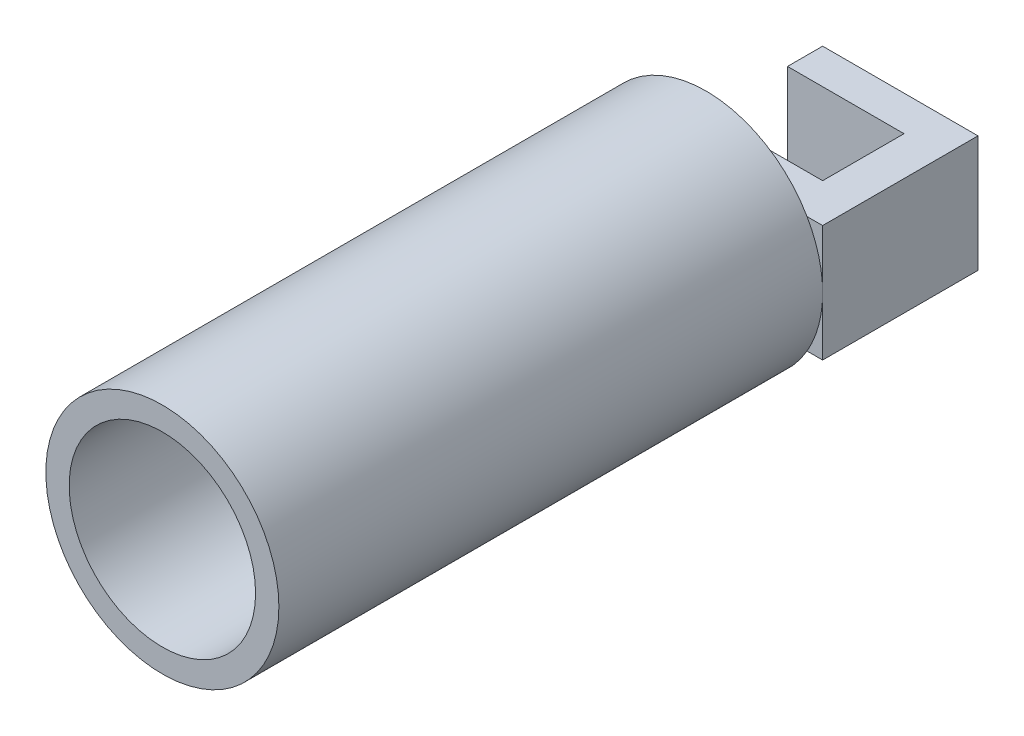
ISO-10303-21;
HEADER;
FILE_DESCRIPTION(('STEP AP214'),'2;1');
FILE_NAME('part.step','',(''),(''),'','','');
FILE_SCHEMA(('AUTOMOTIVE_DESIGN { 1 0 10303 214 1 1 1 1 }'));
ENDSEC;
DATA;
#1=APPLICATION_CONTEXT('core data for automotive mechanical design processes');
#2=APPLICATION_PROTOCOL_DEFINITION('international standard','automotive_design',2000,#1);
#3=PRODUCT_CONTEXT('',#1,'mechanical');
#4=PRODUCT('Part','Part','',(#3));
#5=PRODUCT_RELATED_PRODUCT_CATEGORY('part','',(#4));
#6=PRODUCT_DEFINITION_FORMATION('','',#4);
#7=PRODUCT_DEFINITION_CONTEXT('part definition',#1,'design');
#8=PRODUCT_DEFINITION('design','',#6,#7);
#9=PRODUCT_DEFINITION_SHAPE('','',#8);
#10=(LENGTH_UNIT() NAMED_UNIT(*) SI_UNIT(.MILLI.,.METRE.));
#11=(NAMED_UNIT(*) PLANE_ANGLE_UNIT() SI_UNIT($,.RADIAN.));
#12=(NAMED_UNIT(*) SI_UNIT($,.STERADIAN.) SOLID_ANGLE_UNIT());
#13=UNCERTAINTY_MEASURE_WITH_UNIT(LENGTH_MEASURE(1.E-05),#10,'distance_accuracy_value','');
#14=(GEOMETRIC_REPRESENTATION_CONTEXT(3) GLOBAL_UNCERTAINTY_ASSIGNED_CONTEXT((#13)) GLOBAL_UNIT_ASSIGNED_CONTEXT((#10,
#11,#12)) REPRESENTATION_CONTEXT('',''));
#15=CARTESIAN_POINT('',(0.,0.,0.));
#16=DIRECTION('',(0.,0.,1.));
#17=DIRECTION('',(1.,0.,0.));
#18=AXIS2_PLACEMENT_3D('',#15,#16,#17);
#19=CARTESIAN_POINT('',(10.,7.5,-20.));
#20=DIRECTION('',(1.,0.,0.));
#21=DIRECTION('',(0.,1.,0.));
#22=AXIS2_PLACEMENT_3D('',#19,#20,#21);
#23=PLANE('',#22);
#24=DIRECTION('',(0.,1.,0.));
#25=VECTOR('',#24,1.);
#26=CARTESIAN_POINT('',(10.,7.5,-15.4791523699152));
#27=LINE('',#26,#25);
#28=CARTESIAN_POINT('',(10.,-7.5,-15.4791523699152));
#29=VERTEX_POINT('',#28);
#30=CARTESIAN_POINT('',(10.,7.5,-15.4791523699152));
#31=VERTEX_POINT('',#30);
#32=EDGE_CURVE('E134',#29,#31,#27,.T.);
#33=ORIENTED_EDGE('',*,*,#32,.F.);
#34=DIRECTION('',(0.,0.,1.));
#35=VECTOR('',#34,1.);
#36=CARTESIAN_POINT('',(10.,-7.5,-20.));
#37=LINE('',#36,#35);
#38=CARTESIAN_POINT('',(10.,-7.5,-5.));
#39=VERTEX_POINT('',#38);
#40=EDGE_CURVE('E48',#29,#39,#37,.T.);
#41=ORIENTED_EDGE('',*,*,#40,.T.);
#42=DIRECTION('',(0.,1.,0.));
#43=VECTOR('',#42,1.);
#44=CARTESIAN_POINT('',(10.,7.5,-5.));
#45=LINE('',#44,#43);
#46=CARTESIAN_POINT('',(10.,7.5,-5.));
#47=VERTEX_POINT('',#46);
#48=EDGE_CURVE('E144',#39,#47,#45,.T.);
#49=ORIENTED_EDGE('',*,*,#48,.T.);
#50=DIRECTION('',(0.,0.,1.));
#51=VECTOR('',#50,1.);
#52=CARTESIAN_POINT('',(10.,7.5,-20.));
#53=LINE('',#52,#51);
#54=EDGE_CURVE('E147',#31,#47,#53,.T.);
#55=ORIENTED_EDGE('',*,*,#54,.F.);
#56=EDGE_LOOP('',(#33,#41,#49,#55));
#57=FACE_BOUND('',#56,.T.);
#58=ADVANCED_FACE('F33',(#57),#23,.F.);
#59=CARTESIAN_POINT('',(0.,0.,0.));
#60=DIRECTION('',(0.,0.,1.));
#61=DIRECTION('',(1.,0.,0.));
#62=AXIS2_PLACEMENT_3D('',#59,#60,#61);
#63=PLANE('',#62);
#64=DIRECTION('',(-1.,0.,0.));
#65=VECTOR('',#64,1.);
#66=CARTESIAN_POINT('',(5.,-7.5,0.));
#67=LINE('',#66,#65);
#68=CARTESIAN_POINT('',(12.9903810567666,-7.5,0.));
#69=VERTEX_POINT('',#68);
#70=CARTESIAN_POINT('',(0.,-7.5,0.));
#71=VERTEX_POINT('',#70);
#72=EDGE_CURVE('E168',#69,#71,#67,.T.);
#73=ORIENTED_EDGE('',*,*,#72,.F.);
#74=CARTESIAN_POINT('',(0.,0.,0.));
#75=DIRECTION('',(0.,0.,1.));
#76=DIRECTION('',(1.,0.,0.));
#77=AXIS2_PLACEMENT_3D('',#74,#75,#76);
#78=CIRCLE('',#77,15.);
#79=CARTESIAN_POINT('',(12.9903810567666,7.5,0.));
#80=VERTEX_POINT('',#79);
#81=EDGE_CURVE('E190',#80,#69,#78,.T.);
#82=ORIENTED_EDGE('',*,*,#81,.F.);
#83=DIRECTION('',(1.,0.,0.));
#84=VECTOR('',#83,1.);
#85=CARTESIAN_POINT('',(5.,7.5,0.));
#86=LINE('',#85,#84);
#87=CARTESIAN_POINT('',(0.,7.5,0.));
#88=VERTEX_POINT('',#87);
#89=EDGE_CURVE('E172',#88,#80,#86,.T.);
#90=ORIENTED_EDGE('',*,*,#89,.F.);
#91=DIRECTION('',(0.,1.,0.));
#92=VECTOR('',#91,1.);
#93=CARTESIAN_POINT('',(0.,7.5,0.));
#94=LINE('',#93,#92);
#95=EDGE_CURVE('E56',#71,#88,#94,.T.);
#96=ORIENTED_EDGE('',*,*,#95,.F.);
#97=EDGE_LOOP('',(#73,#82,#90,#96));
#98=FACE_BOUND('',#97,.T.);
#99=ADVANCED_FACE('F204',(#98),#63,.F.);
#100=CARTESIAN_POINT('',(0.,0.,70.));
#101=DIRECTION('',(0.,0.,-1.));
#102=DIRECTION('',(-1.,0.,0.));
#103=AXIS2_PLACEMENT_3D('',#100,#101,#102);
#104=CYLINDRICAL_SURFACE('',#103,15.);
#105=CARTESIAN_POINT('',(0.,0.,70.));
#106=DIRECTION('',(0.,0.,1.));
#107=DIRECTION('',(1.,0.,0.));
#108=AXIS2_PLACEMENT_3D('',#105,#106,#107);
#109=CIRCLE('',#108,15.);
#110=CARTESIAN_POINT('',(15.,0.,70.));
#111=VERTEX_POINT('',#110);
#112=EDGE_CURVE('E11',#111,#111,#109,.T.);
#113=ORIENTED_EDGE('',*,*,#112,.F.);
#114=EDGE_LOOP('',(#113));
#115=FACE_BOUND('',#114,.T.);
#116=CARTESIAN_POINT('',(15.,0.,0.));
#117=VERTEX_POINT('',#116);
#118=EDGE_CURVE('E37',#117,#80,#78,.T.);
#119=ORIENTED_EDGE('',*,*,#118,.T.);
#120=ORIENTED_EDGE('',*,*,#81,.T.);
#121=CARTESIAN_POINT('',(0.,0.,0.));
#122=DIRECTION('',(0.,0.,-1.));
#123=DIRECTION('',(-1.,0.,0.));
#124=AXIS2_PLACEMENT_3D('',#121,#122,#123);
#125=CIRCLE('',#124,15.);
#126=EDGE_CURVE('E165',#117,#69,#125,.T.);
#127=ORIENTED_EDGE('',*,*,#126,.F.);
#128=EDGE_LOOP('',(#119,#120,#127));
#129=FACE_BOUND('',#128,.T.);
#130=ADVANCED_FACE('F35',(#115,#129),#104,.T.);
#131=CARTESIAN_POINT('',(0.,0.,70.));
#132=DIRECTION('',(0.,0.,1.));
#133=DIRECTION('',(1.,0.,0.));
#134=AXIS2_PLACEMENT_3D('',#131,#132,#133);
#135=PLANE('',#134);
#136=CARTESIAN_POINT('',(0.,0.,70.));
#137=DIRECTION('',(0.,0.,1.));
#138=DIRECTION('',(1.,0.,0.));
#139=AXIS2_PLACEMENT_3D('',#136,#137,#138);
#140=CIRCLE('',#139,12.);
#141=CARTESIAN_POINT('',(12.,0.,70.));
#142=VERTEX_POINT('',#141);
#143=EDGE_CURVE('E186',#142,#142,#140,.T.);
#144=ORIENTED_EDGE('',*,*,#143,.F.);
#145=EDGE_LOOP('',(#144));
#146=FACE_BOUND('',#145,.T.);
#147=ORIENTED_EDGE('',*,*,#112,.T.);
#148=EDGE_LOOP('',(#147));
#149=FACE_BOUND('',#148,.T.);
#150=ADVANCED_FACE('F196',(#146,#149),#135,.T.);
#151=CARTESIAN_POINT('',(0.,0.,5.));
#152=DIRECTION('',(0.,0.,1.));
#153=DIRECTION('',(1.,0.,0.));
#154=AXIS2_PLACEMENT_3D('',#151,#152,#153);
#155=CYLINDRICAL_SURFACE('',#154,12.);
#156=CARTESIAN_POINT('',(0.,0.,5.));
#157=DIRECTION('',(0.,0.,1.));
#158=DIRECTION('',(1.,0.,0.));
#159=AXIS2_PLACEMENT_3D('',#156,#157,#158);
#160=CIRCLE('',#159,12.);
#161=CARTESIAN_POINT('',(12.,0.,5.));
#162=VERTEX_POINT('',#161);
#163=EDGE_CURVE('E187',#162,#162,#160,.T.);
#164=ORIENTED_EDGE('',*,*,#163,.F.);
#165=EDGE_LOOP('',(#164));
#166=FACE_BOUND('',#165,.T.);
#167=ORIENTED_EDGE('',*,*,#143,.T.);
#168=EDGE_LOOP('',(#167));
#169=FACE_BOUND('',#168,.T.);
#170=ADVANCED_FACE('F194',(#166,#169),#155,.F.);
#171=CARTESIAN_POINT('',(0.,0.,5.));
#172=DIRECTION('',(0.,0.,1.));
#173=DIRECTION('',(1.,0.,0.));
#174=AXIS2_PLACEMENT_3D('',#171,#172,#173);
#175=PLANE('',#174);
#176=ORIENTED_EDGE('',*,*,#163,.T.);
#177=EDGE_LOOP('',(#176));
#178=FACE_BOUND('',#177,.T.);
#179=ADVANCED_FACE('F260',(#178),#175,.T.);
#180=CARTESIAN_POINT('',(5.,-7.5,-5.));
#181=DIRECTION('',(0.,1.,0.));
#182=DIRECTION('',(-1.,0.,0.));
#183=AXIS2_PLACEMENT_3D('',#180,#181,#182);
#184=PLANE('',#183);
#185=ORIENTED_EDGE('',*,*,#72,.T.);
#186=DIRECTION('',(0.,0.,1.));
#187=VECTOR('',#186,1.);
#188=CARTESIAN_POINT('',(0.,-7.5,-5.));
#189=LINE('',#188,#187);
#190=CARTESIAN_POINT('',(0.,-7.5,-5.));
#191=VERTEX_POINT('',#190);
#192=EDGE_CURVE('E183',#191,#71,#189,.T.);
#193=ORIENTED_EDGE('',*,*,#192,.F.);
#194=DIRECTION('',(-1.,0.,0.));
#195=VECTOR('',#194,1.);
#196=CARTESIAN_POINT('',(5.,-7.5,-5.));
#197=LINE('',#196,#195);
#198=EDGE_CURVE('E169',#39,#191,#197,.T.);
#199=ORIENTED_EDGE('',*,*,#198,.F.);
#200=ORIENTED_EDGE('',*,*,#40,.F.);
#201=DIRECTION('',(1.,0.,0.));
#202=VECTOR('',#201,1.);
#203=CARTESIAN_POINT('',(-5.,-7.5,-15.4791523699152));
#204=LINE('',#203,#202);
#205=CARTESIAN_POINT('',(-5.,-7.5,-15.4791523699152));
#206=VERTEX_POINT('',#205);
#207=EDGE_CURVE('E125',#206,#29,#204,.T.);
#208=ORIENTED_EDGE('',*,*,#207,.F.);
#209=DIRECTION('',(0.,0.,1.));
#210=VECTOR('',#209,1.);
#211=CARTESIAN_POINT('',(-5.,-7.5,-15.4791523699152));
#212=LINE('',#211,#210);
#213=CARTESIAN_POINT('',(-5.,-7.5,-20.));
#214=VERTEX_POINT('',#213);
#215=EDGE_CURVE('E123',#214,#206,#212,.T.);
#216=ORIENTED_EDGE('',*,*,#215,.F.);
#217=DIRECTION('',(-1.,0.,0.));
#218=VECTOR('',#217,1.);
#219=CARTESIAN_POINT('',(10.,-7.5,-20.));
#220=LINE('',#219,#218);
#221=CARTESIAN_POINT('',(15.,-7.5,-20.));
#222=VERTEX_POINT('',#221);
#223=EDGE_CURVE('E110',#222,#214,#220,.T.);
#224=ORIENTED_EDGE('',*,*,#223,.F.);
#225=DIRECTION('',(0.,0.,-1.));
#226=VECTOR('',#225,1.);
#227=CARTESIAN_POINT('',(15.,-7.5,-5.));
#228=LINE('',#227,#226);
#229=CARTESIAN_POINT('',(15.,-7.5,0.));
#230=VERTEX_POINT('',#229);
#231=EDGE_CURVE('E155',#230,#222,#228,.T.);
#232=ORIENTED_EDGE('',*,*,#231,.F.);
#233=DIRECTION('',(-1.,0.,0.));
#234=VECTOR('',#233,1.);
#235=CARTESIAN_POINT('',(15.,-7.5,0.));
#236=LINE('',#235,#234);
#237=EDGE_CURVE('E162',#230,#69,#236,.T.);
#238=ORIENTED_EDGE('',*,*,#237,.T.);
#239=EDGE_LOOP('',(#185,#193,#199,#200,#208,#216,#224,#232,#238));
#240=FACE_BOUND('',#239,.T.);
#241=ADVANCED_FACE('F124',(#240),#184,.F.);
#242=CARTESIAN_POINT('',(0.,7.5,-5.));
#243=DIRECTION('',(1.,0.,0.));
#244=DIRECTION('',(0.,1.,0.));
#245=AXIS2_PLACEMENT_3D('',#242,#243,#244);
#246=PLANE('',#245);
#247=ORIENTED_EDGE('',*,*,#95,.T.);
#248=DIRECTION('',(0.,0.,1.));
#249=VECTOR('',#248,1.);
#250=CARTESIAN_POINT('',(0.,7.5,-5.));
#251=LINE('',#250,#249);
#252=CARTESIAN_POINT('',(0.,7.5,-5.));
#253=VERTEX_POINT('',#252);
#254=EDGE_CURVE('E177',#253,#88,#251,.T.);
#255=ORIENTED_EDGE('',*,*,#254,.F.);
#256=DIRECTION('',(0.,1.,0.));
#257=VECTOR('',#256,1.);
#258=CARTESIAN_POINT('',(0.,7.5,-5.));
#259=LINE('',#258,#257);
#260=EDGE_CURVE('E171',#191,#253,#259,.T.);
#261=ORIENTED_EDGE('',*,*,#260,.F.);
#262=ORIENTED_EDGE('',*,*,#192,.T.);
#263=EDGE_LOOP('',(#247,#255,#261,#262));
#264=FACE_BOUND('',#263,.T.);
#265=ADVANCED_FACE('F224',(#264),#246,.F.);
#266=CARTESIAN_POINT('',(5.,7.5,-5.));
#267=DIRECTION('',(0.,-1.,0.));
#268=DIRECTION('',(1.,0.,0.));
#269=AXIS2_PLACEMENT_3D('',#266,#267,#268);
#270=PLANE('',#269);
#271=ORIENTED_EDGE('',*,*,#89,.T.);
#272=DIRECTION('',(-1.,0.,0.));
#273=VECTOR('',#272,1.);
#274=CARTESIAN_POINT('',(15.,7.5,0.));
#275=LINE('',#274,#273);
#276=CARTESIAN_POINT('',(15.,7.5,0.));
#277=VERTEX_POINT('',#276);
#278=EDGE_CURVE('E159',#277,#80,#275,.T.);
#279=ORIENTED_EDGE('',*,*,#278,.F.);
#280=DIRECTION('',(0.,0.,1.));
#281=VECTOR('',#280,1.);
#282=CARTESIAN_POINT('',(15.,7.5,0.));
#283=LINE('',#282,#281);
#284=CARTESIAN_POINT('',(15.,7.5,-20.));
#285=VERTEX_POINT('',#284);
#286=EDGE_CURVE('E157',#285,#277,#283,.T.);
#287=ORIENTED_EDGE('',*,*,#286,.F.);
#288=DIRECTION('',(1.,0.,0.));
#289=VECTOR('',#288,1.);
#290=CARTESIAN_POINT('',(15.,7.5,-20.));
#291=LINE('',#290,#289);
#292=CARTESIAN_POINT('',(-5.,7.5,-20.));
#293=VERTEX_POINT('',#292);
#294=EDGE_CURVE('E120',#293,#285,#291,.T.);
#295=ORIENTED_EDGE('',*,*,#294,.F.);
#296=DIRECTION('',(0.,0.,-1.));
#297=VECTOR('',#296,1.);
#298=CARTESIAN_POINT('',(-5.,7.5,-20.));
#299=LINE('',#298,#297);
#300=CARTESIAN_POINT('',(-5.,7.5,-15.4791523699152));
#301=VERTEX_POINT('',#300);
#302=EDGE_CURVE('E133',#301,#293,#299,.T.);
#303=ORIENTED_EDGE('',*,*,#302,.F.);
#304=DIRECTION('',(1.,0.,0.));
#305=VECTOR('',#304,1.);
#306=CARTESIAN_POINT('',(-5.,7.5,-15.4791523699152));
#307=LINE('',#306,#305);
#308=EDGE_CURVE('E139',#301,#31,#307,.T.);
#309=ORIENTED_EDGE('',*,*,#308,.T.);
#310=ORIENTED_EDGE('',*,*,#54,.T.);
#311=DIRECTION('',(1.,0.,0.));
#312=VECTOR('',#311,1.);
#313=CARTESIAN_POINT('',(5.,7.5,-5.));
#314=LINE('',#313,#312);
#315=EDGE_CURVE('E174',#253,#47,#314,.T.);
#316=ORIENTED_EDGE('',*,*,#315,.F.);
#317=ORIENTED_EDGE('',*,*,#254,.T.);
#318=EDGE_LOOP('',(#271,#279,#287,#295,#303,#309,#310,#316,#317));
#319=FACE_BOUND('',#318,.T.);
#320=ADVANCED_FACE('F220',(#319),#270,.F.);
#321=CARTESIAN_POINT('',(0.,0.,-5.));
#322=DIRECTION('',(0.,0.,-1.));
#323=DIRECTION('',(-1.,0.,0.));
#324=AXIS2_PLACEMENT_3D('',#321,#322,#323);
#325=PLANE('',#324);
#326=ORIENTED_EDGE('',*,*,#48,.F.);
#327=ORIENTED_EDGE('',*,*,#198,.T.);
#328=ORIENTED_EDGE('',*,*,#260,.T.);
#329=ORIENTED_EDGE('',*,*,#315,.T.);
#330=EDGE_LOOP('',(#326,#327,#328,#329));
#331=FACE_BOUND('',#330,.T.);
#332=ADVANCED_FACE('F229',(#331),#325,.T.);
#333=CARTESIAN_POINT('',(15.,-7.5,0.));
#334=DIRECTION('',(0.,0.,-1.));
#335=DIRECTION('',(-1.,0.,0.));
#336=AXIS2_PLACEMENT_3D('',#333,#334,#335);
#337=PLANE('',#336);
#338=ORIENTED_EDGE('',*,*,#278,.T.);
#339=ORIENTED_EDGE('',*,*,#118,.F.);
#340=DIRECTION('',(0.,-1.,0.));
#341=VECTOR('',#340,1.);
#342=CARTESIAN_POINT('',(15.,-7.5,0.));
#343=LINE('',#342,#341);
#344=EDGE_CURVE('E152',#277,#117,#343,.T.);
#345=ORIENTED_EDGE('',*,*,#344,.F.);
#346=EDGE_LOOP('',(#338,#339,#345));
#347=FACE_BOUND('',#346,.T.);
#348=ADVANCED_FACE('F212',(#347),#337,.F.);
#349=EDGE_CURVE('E151',#117,#230,#343,.T.);
#350=ORIENTED_EDGE('',*,*,#349,.F.);
#351=ORIENTED_EDGE('',*,*,#126,.T.);
#352=ORIENTED_EDGE('',*,*,#237,.F.);
#353=EDGE_LOOP('',(#350,#351,#352));
#354=FACE_BOUND('',#353,.T.);
#355=ADVANCED_FACE('F216',(#354),#337,.F.);
#356=CARTESIAN_POINT('',(15.,0.,0.));
#357=DIRECTION('',(-1.,0.,0.));
#358=DIRECTION('',(0.,-1.,0.));
#359=AXIS2_PLACEMENT_3D('',#356,#357,#358);
#360=PLANE('',#359);
#361=ORIENTED_EDGE('',*,*,#344,.T.);
#362=ORIENTED_EDGE('',*,*,#349,.T.);
#363=ORIENTED_EDGE('',*,*,#231,.T.);
#364=DIRECTION('',(0.,-1.,0.));
#365=VECTOR('',#364,1.);
#366=CARTESIAN_POINT('',(15.,-7.5,-20.));
#367=LINE('',#366,#365);
#368=EDGE_CURVE('E117',#285,#222,#367,.T.);
#369=ORIENTED_EDGE('',*,*,#368,.F.);
#370=ORIENTED_EDGE('',*,*,#286,.T.);
#371=EDGE_LOOP('',(#361,#362,#363,#369,#370));
#372=FACE_BOUND('',#371,.T.);
#373=ADVANCED_FACE('F218',(#372),#360,.F.);
#374=CARTESIAN_POINT('',(0.,0.,-20.));
#375=DIRECTION('',(0.,0.,1.));
#376=DIRECTION('',(1.,0.,0.));
#377=AXIS2_PLACEMENT_3D('',#374,#375,#376);
#378=PLANE('',#377);
#379=ORIENTED_EDGE('',*,*,#368,.T.);
#380=ORIENTED_EDGE('',*,*,#223,.T.);
#381=DIRECTION('',(0.,-1.,0.));
#382=VECTOR('',#381,1.);
#383=CARTESIAN_POINT('',(-5.,-7.5,-20.));
#384=LINE('',#383,#382);
#385=EDGE_CURVE('E115',#293,#214,#384,.T.);
#386=ORIENTED_EDGE('',*,*,#385,.F.);
#387=ORIENTED_EDGE('',*,*,#294,.T.);
#388=EDGE_LOOP('',(#379,#380,#386,#387));
#389=FACE_BOUND('',#388,.T.);
#390=ADVANCED_FACE('F112',(#389),#378,.F.);
#391=CARTESIAN_POINT('',(-5.,7.5,-15.4791523699152));
#392=DIRECTION('',(0.,0.,-1.));
#393=DIRECTION('',(-1.,0.,0.));
#394=AXIS2_PLACEMENT_3D('',#391,#392,#393);
#395=PLANE('',#394);
#396=ORIENTED_EDGE('',*,*,#32,.T.);
#397=ORIENTED_EDGE('',*,*,#308,.F.);
#398=DIRECTION('',(0.,1.,0.));
#399=VECTOR('',#398,1.);
#400=CARTESIAN_POINT('',(-5.,7.5,-15.4791523699152));
#401=LINE('',#400,#399);
#402=EDGE_CURVE('E128',#206,#301,#401,.T.);
#403=ORIENTED_EDGE('',*,*,#402,.F.);
#404=ORIENTED_EDGE('',*,*,#207,.T.);
#405=EDGE_LOOP('',(#396,#397,#403,#404));
#406=FACE_BOUND('',#405,.T.);
#407=ADVANCED_FACE('F233',(#406),#395,.F.);
#408=CARTESIAN_POINT('',(-5.,0.,0.));
#409=DIRECTION('',(1.,0.,0.));
#410=DIRECTION('',(0.,1.,0.));
#411=AXIS2_PLACEMENT_3D('',#408,#409,#410);
#412=PLANE('',#411);
#413=ORIENTED_EDGE('',*,*,#385,.T.);
#414=ORIENTED_EDGE('',*,*,#215,.T.);
#415=ORIENTED_EDGE('',*,*,#402,.T.);
#416=ORIENTED_EDGE('',*,*,#302,.T.);
#417=EDGE_LOOP('',(#413,#414,#415,#416));
#418=FACE_BOUND('',#417,.T.);
#419=ADVANCED_FACE('F131',(#418),#412,.F.);
#420=CLOSED_SHELL('',(#58,#99,#130,#150,#170,#179,#241,#265,#320,#332,#348,#355,#373,#390,#407,#419));
#421=MANIFOLD_SOLID_BREP('B2',#420);
#422=ADVANCED_BREP_SHAPE_REPRESENTATION('',(#18,#421),#14);
#423=SHAPE_DEFINITION_REPRESENTATION(#9,#422);
ENDSEC;
END-ISO-10303-21;
